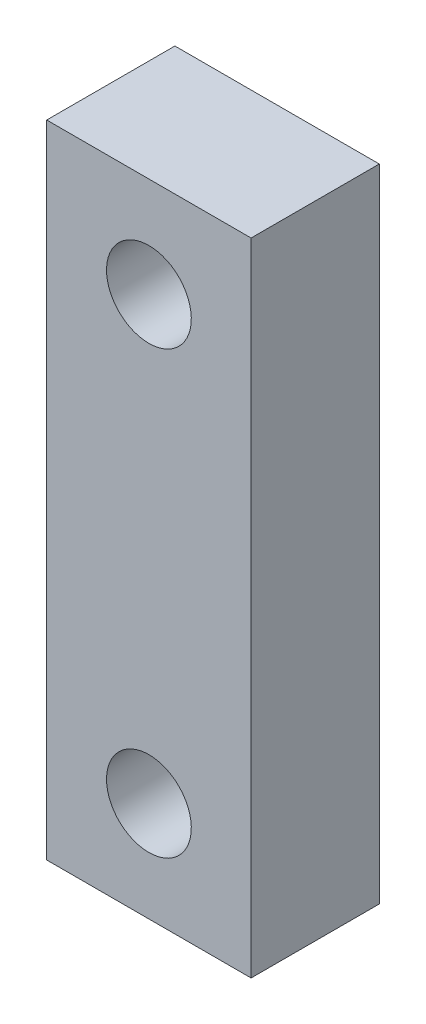
ISO-10303-21;
HEADER;
FILE_DESCRIPTION(('STEP AP214'),'2;1');
FILE_NAME('part.step','',(''),(''),'','','');
FILE_SCHEMA(('AUTOMOTIVE_DESIGN { 1 0 10303 214 1 1 1 1 }'));
ENDSEC;
DATA;
#1=APPLICATION_CONTEXT('core data for automotive mechanical design processes');
#2=APPLICATION_PROTOCOL_DEFINITION('international standard','automotive_design',2000,#1);
#3=PRODUCT_CONTEXT('',#1,'mechanical');
#4=PRODUCT('Part','Part','',(#3));
#5=PRODUCT_RELATED_PRODUCT_CATEGORY('part','',(#4));
#6=PRODUCT_DEFINITION_FORMATION('','',#4);
#7=PRODUCT_DEFINITION_CONTEXT('part definition',#1,'design');
#8=PRODUCT_DEFINITION('design','',#6,#7);
#9=PRODUCT_DEFINITION_SHAPE('','',#8);
#10=(LENGTH_UNIT() NAMED_UNIT(*) SI_UNIT(.MILLI.,.METRE.));
#11=(NAMED_UNIT(*) PLANE_ANGLE_UNIT() SI_UNIT($,.RADIAN.));
#12=(NAMED_UNIT(*) SI_UNIT($,.STERADIAN.) SOLID_ANGLE_UNIT());
#13=UNCERTAINTY_MEASURE_WITH_UNIT(LENGTH_MEASURE(1.E-05),#10,'distance_accuracy_value','');
#14=(GEOMETRIC_REPRESENTATION_CONTEXT(3) GLOBAL_UNCERTAINTY_ASSIGNED_CONTEXT((#13)) GLOBAL_UNIT_ASSIGNED_CONTEXT((#10,
#11,#12)) REPRESENTATION_CONTEXT('',''));
#15=CARTESIAN_POINT('',(0.,0.,0.));
#16=DIRECTION('',(0.,0.,1.));
#17=DIRECTION('',(1.,0.,0.));
#18=AXIS2_PLACEMENT_3D('',#15,#16,#17);
#19=CARTESIAN_POINT('',(468.012400016,1.34946582121283E-11,564.642));
#20=DIRECTION('',(1.,0.,0.));
#21=DIRECTION('',(0.,0.,-1.));
#22=AXIS2_PLACEMENT_3D('',#19,#20,#21);
#23=PLANE('',#22);
#24=DIRECTION('',(0.,1.,0.));
#25=VECTOR('',#24,1.);
#26=CARTESIAN_POINT('',(468.012400016,1.34946582121283E-11,570.992));
#27=LINE('',#26,#25);
#28=CARTESIAN_POINT('',(468.012400016,-15.8749999999869,570.992000000001));
#29=VERTEX_POINT('',#28);
#30=CARTESIAN_POINT('',(468.012400016,15.8750000000131,570.992));
#31=VERTEX_POINT('',#30);
#32=EDGE_CURVE('E97',#29,#31,#27,.T.);
#33=ORIENTED_EDGE('',*,*,#32,.T.);
#34=DIRECTION('',(0.,0.,1.));
#35=VECTOR('',#34,1.);
#36=CARTESIAN_POINT('',(468.012400016,15.8750000000131,564.642));
#37=LINE('',#36,#35);
#38=CARTESIAN_POINT('',(468.012400016,15.8750000000131,564.642));
#39=VERTEX_POINT('',#38);
#40=EDGE_CURVE('E11',#39,#31,#37,.T.);
#41=ORIENTED_EDGE('',*,*,#40,.F.);
#42=DIRECTION('',(0.,1.,0.));
#43=VECTOR('',#42,1.);
#44=CARTESIAN_POINT('',(468.012400016,1.34946582121283E-11,564.642));
#45=LINE('',#44,#43);
#46=CARTESIAN_POINT('',(468.012400016,-15.8749999999869,564.642000000001));
#47=VERTEX_POINT('',#46);
#48=EDGE_CURVE('E85',#47,#39,#45,.T.);
#49=ORIENTED_EDGE('',*,*,#48,.F.);
#50=DIRECTION('',(0.,0.,1.));
#51=VECTOR('',#50,1.);
#52=CARTESIAN_POINT('',(468.012400016,-15.8749999999869,564.642000000001));
#53=LINE('',#52,#51);
#54=EDGE_CURVE('E93',#47,#29,#53,.T.);
#55=ORIENTED_EDGE('',*,*,#54,.T.);
#56=EDGE_LOOP('',(#33,#41,#49,#55));
#57=FACE_BOUND('',#56,.T.);
#58=ADVANCED_FACE('F34',(#57),#23,.F.);
#59=CARTESIAN_POINT('',(0.,15.8750000000131,564.642));
#60=DIRECTION('',(0.,-1.,0.));
#61=DIRECTION('',(0.,0.,-1.));
#62=AXIS2_PLACEMENT_3D('',#59,#60,#61);
#63=PLANE('',#62);
#64=DIRECTION('',(1.,0.,0.));
#65=VECTOR('',#64,1.);
#66=CARTESIAN_POINT('',(0.,15.8750000000131,570.992));
#67=LINE('',#66,#65);
#68=CARTESIAN_POINT('',(478.137599984,15.8750000000131,570.992));
#69=VERTEX_POINT('',#68);
#70=EDGE_CURVE('E89',#31,#69,#67,.T.);
#71=ORIENTED_EDGE('',*,*,#70,.T.);
#72=DIRECTION('',(0.,0.,1.));
#73=VECTOR('',#72,1.);
#74=CARTESIAN_POINT('',(478.137599984,15.8750000000131,564.642));
#75=LINE('',#74,#73);
#76=CARTESIAN_POINT('',(478.137599984,15.8750000000131,564.642));
#77=VERTEX_POINT('',#76);
#78=EDGE_CURVE('E42',#77,#69,#75,.T.);
#79=ORIENTED_EDGE('',*,*,#78,.F.);
#80=DIRECTION('',(1.,0.,0.));
#81=VECTOR('',#80,1.);
#82=CARTESIAN_POINT('',(0.,15.8750000000131,564.642));
#83=LINE('',#82,#81);
#84=EDGE_CURVE('E80',#39,#77,#83,.T.);
#85=ORIENTED_EDGE('',*,*,#84,.F.);
#86=ORIENTED_EDGE('',*,*,#40,.T.);
#87=EDGE_LOOP('',(#71,#79,#85,#86));
#88=FACE_BOUND('',#87,.T.);
#89=ADVANCED_FACE('F88',(#88),#63,.F.);
#90=CARTESIAN_POINT('',(478.137599984,1.34946582121283E-11,564.642));
#91=DIRECTION('',(-1.,0.,0.));
#92=DIRECTION('',(0.,0.,1.));
#93=AXIS2_PLACEMENT_3D('',#90,#91,#92);
#94=PLANE('',#93);
#95=DIRECTION('',(0.,-1.,0.));
#96=VECTOR('',#95,1.);
#97=CARTESIAN_POINT('',(478.137599984,1.34946582121283E-11,570.992));
#98=LINE('',#97,#96);
#99=CARTESIAN_POINT('',(478.137599984,-15.8749999999869,570.992000000001));
#100=VERTEX_POINT('',#99);
#101=EDGE_CURVE('E67',#69,#100,#98,.T.);
#102=ORIENTED_EDGE('',*,*,#101,.T.);
#103=DIRECTION('',(0.,0.,1.));
#104=VECTOR('',#103,1.);
#105=CARTESIAN_POINT('',(478.137599984,-15.8749999999869,564.642000000001));
#106=LINE('',#105,#104);
#107=CARTESIAN_POINT('',(478.137599984,-15.8749999999869,564.642000000001));
#108=VERTEX_POINT('',#107);
#109=EDGE_CURVE('E90',#108,#100,#106,.T.);
#110=ORIENTED_EDGE('',*,*,#109,.F.);
#111=DIRECTION('',(0.,-1.,0.));
#112=VECTOR('',#111,1.);
#113=CARTESIAN_POINT('',(478.137599984,1.34946582121283E-11,564.642));
#114=LINE('',#113,#112);
#115=EDGE_CURVE('E83',#77,#108,#114,.T.);
#116=ORIENTED_EDGE('',*,*,#115,.F.);
#117=ORIENTED_EDGE('',*,*,#78,.T.);
#118=EDGE_LOOP('',(#102,#110,#116,#117));
#119=FACE_BOUND('',#118,.T.);
#120=ADVANCED_FACE('F91',(#119),#94,.F.);
#121=CARTESIAN_POINT('',(0.,-15.8749999999869,564.642000000001));
#122=DIRECTION('',(0.,1.,0.));
#123=DIRECTION('',(0.,0.,1.));
#124=AXIS2_PLACEMENT_3D('',#121,#122,#123);
#125=PLANE('',#124);
#126=DIRECTION('',(-1.,0.,0.));
#127=VECTOR('',#126,1.);
#128=CARTESIAN_POINT('',(0.,-15.8749999999869,570.992000000001));
#129=LINE('',#128,#127);
#130=EDGE_CURVE('E73',#100,#29,#129,.T.);
#131=ORIENTED_EDGE('',*,*,#130,.T.);
#132=ORIENTED_EDGE('',*,*,#54,.F.);
#133=DIRECTION('',(-1.,0.,0.));
#134=VECTOR('',#133,1.);
#135=CARTESIAN_POINT('',(0.,-15.8749999999869,564.642000000001));
#136=LINE('',#135,#134);
#137=EDGE_CURVE('E50',#108,#47,#136,.T.);
#138=ORIENTED_EDGE('',*,*,#137,.F.);
#139=ORIENTED_EDGE('',*,*,#109,.T.);
#140=EDGE_LOOP('',(#131,#132,#138,#139));
#141=FACE_BOUND('',#140,.T.);
#142=ADVANCED_FACE('F105',(#141),#125,.F.);
#143=CARTESIAN_POINT('',(0.,1.34907100505897E-11,564.642));
#144=DIRECTION('',(0.,0.,-1.));
#145=DIRECTION('',(0.,1.,0.));
#146=AXIS2_PLACEMENT_3D('',#143,#144,#145);
#147=PLANE('',#146);
#148=CARTESIAN_POINT('',(473.075,10.9220000000131,564.642));
#149=DIRECTION('',(0.,0.,1.));
#150=DIRECTION('',(0.,-1.,0.));
#151=AXIS2_PLACEMENT_3D('',#148,#149,#150);
#152=CIRCLE('',#151,2.09999999999999);
#153=CARTESIAN_POINT('',(473.075,8.82200000001315,564.642));
#154=VERTEX_POINT('',#153);
#155=EDGE_CURVE('E114',#154,#154,#152,.T.);
#156=ORIENTED_EDGE('',*,*,#155,.T.);
#157=EDGE_LOOP('',(#156));
#158=FACE_BOUND('',#157,.T.);
#159=CARTESIAN_POINT('',(473.075,-10.9219999999869,564.642000000001));
#160=DIRECTION('',(0.,0.,1.));
#161=DIRECTION('',(0.,-1.,0.));
#162=AXIS2_PLACEMENT_3D('',#159,#160,#161);
#163=CIRCLE('',#162,2.09999999999999);
#164=CARTESIAN_POINT('',(473.075,-13.0219999999869,564.642000000001));
#165=VERTEX_POINT('',#164);
#166=EDGE_CURVE('E100',#165,#165,#163,.T.);
#167=ORIENTED_EDGE('',*,*,#166,.T.);
#168=EDGE_LOOP('',(#167));
#169=FACE_BOUND('',#168,.T.);
#170=ORIENTED_EDGE('',*,*,#48,.T.);
#171=ORIENTED_EDGE('',*,*,#84,.T.);
#172=ORIENTED_EDGE('',*,*,#115,.T.);
#173=ORIENTED_EDGE('',*,*,#137,.T.);
#174=EDGE_LOOP('',(#170,#171,#172,#173));
#175=FACE_BOUND('',#174,.T.);
#176=ADVANCED_FACE('F81',(#158,#169,#175),#147,.T.);
#177=CARTESIAN_POINT('',(0.,1.34907100505897E-11,570.992));
#178=DIRECTION('',(0.,0.,-1.));
#179=DIRECTION('',(0.,1.,0.));
#180=AXIS2_PLACEMENT_3D('',#177,#178,#179);
#181=PLANE('',#180);
#182=CARTESIAN_POINT('',(473.075,10.9220000000131,570.992));
#183=DIRECTION('',(0.,0.,1.));
#184=DIRECTION('',(0.,-1.,0.));
#185=AXIS2_PLACEMENT_3D('',#182,#183,#184);
#186=CIRCLE('',#185,2.09999999999999);
#187=CARTESIAN_POINT('',(473.075,8.82200000001315,570.992));
#188=VERTEX_POINT('',#187);
#189=EDGE_CURVE('E117',#188,#188,#186,.T.);
#190=ORIENTED_EDGE('',*,*,#189,.F.);
#191=EDGE_LOOP('',(#190));
#192=FACE_BOUND('',#191,.T.);
#193=CARTESIAN_POINT('',(473.075,-10.9219999999869,570.992000000001));
#194=DIRECTION('',(0.,0.,1.));
#195=DIRECTION('',(0.,-1.,0.));
#196=AXIS2_PLACEMENT_3D('',#193,#194,#195);
#197=CIRCLE('',#196,2.09999999999999);
#198=CARTESIAN_POINT('',(473.075,-13.0219999999869,570.992000000001));
#199=VERTEX_POINT('',#198);
#200=EDGE_CURVE('E111',#199,#199,#197,.T.);
#201=ORIENTED_EDGE('',*,*,#200,.F.);
#202=EDGE_LOOP('',(#201));
#203=FACE_BOUND('',#202,.T.);
#204=ORIENTED_EDGE('',*,*,#32,.F.);
#205=ORIENTED_EDGE('',*,*,#130,.F.);
#206=ORIENTED_EDGE('',*,*,#101,.F.);
#207=ORIENTED_EDGE('',*,*,#70,.F.);
#208=EDGE_LOOP('',(#204,#205,#206,#207));
#209=FACE_BOUND('',#208,.T.);
#210=ADVANCED_FACE('F108',(#192,#203,#209),#181,.F.);
#211=CARTESIAN_POINT('',(473.075,-10.9219999999869,564.642000000001));
#212=DIRECTION('',(0.,0.,1.));
#213=DIRECTION('',(1.,0.,0.));
#214=AXIS2_PLACEMENT_3D('',#211,#212,#213);
#215=CYLINDRICAL_SURFACE('',#214,2.09999999999999);
#216=ORIENTED_EDGE('',*,*,#166,.F.);
#217=EDGE_LOOP('',(#216));
#218=FACE_BOUND('',#217,.T.);
#219=ORIENTED_EDGE('',*,*,#200,.T.);
#220=EDGE_LOOP('',(#219));
#221=FACE_BOUND('',#220,.T.);
#222=ADVANCED_FACE('F128',(#218,#221),#215,.F.);
#223=CARTESIAN_POINT('',(473.075,10.9220000000131,564.642));
#224=DIRECTION('',(0.,0.,1.));
#225=DIRECTION('',(1.,0.,0.));
#226=AXIS2_PLACEMENT_3D('',#223,#224,#225);
#227=CYLINDRICAL_SURFACE('',#226,2.09999999999999);
#228=ORIENTED_EDGE('',*,*,#155,.F.);
#229=EDGE_LOOP('',(#228));
#230=FACE_BOUND('',#229,.T.);
#231=ORIENTED_EDGE('',*,*,#189,.T.);
#232=EDGE_LOOP('',(#231));
#233=FACE_BOUND('',#232,.T.);
#234=ADVANCED_FACE('F125',(#230,#233),#227,.F.);
#235=CLOSED_SHELL('',(#58,#89,#120,#142,#176,#210,#222,#234));
#236=MANIFOLD_SOLID_BREP('B2',#235);
#237=ADVANCED_BREP_SHAPE_REPRESENTATION('',(#18,#236),#14);
#238=SHAPE_DEFINITION_REPRESENTATION(#9,#237);
ENDSEC;
END-ISO-10303-21;
